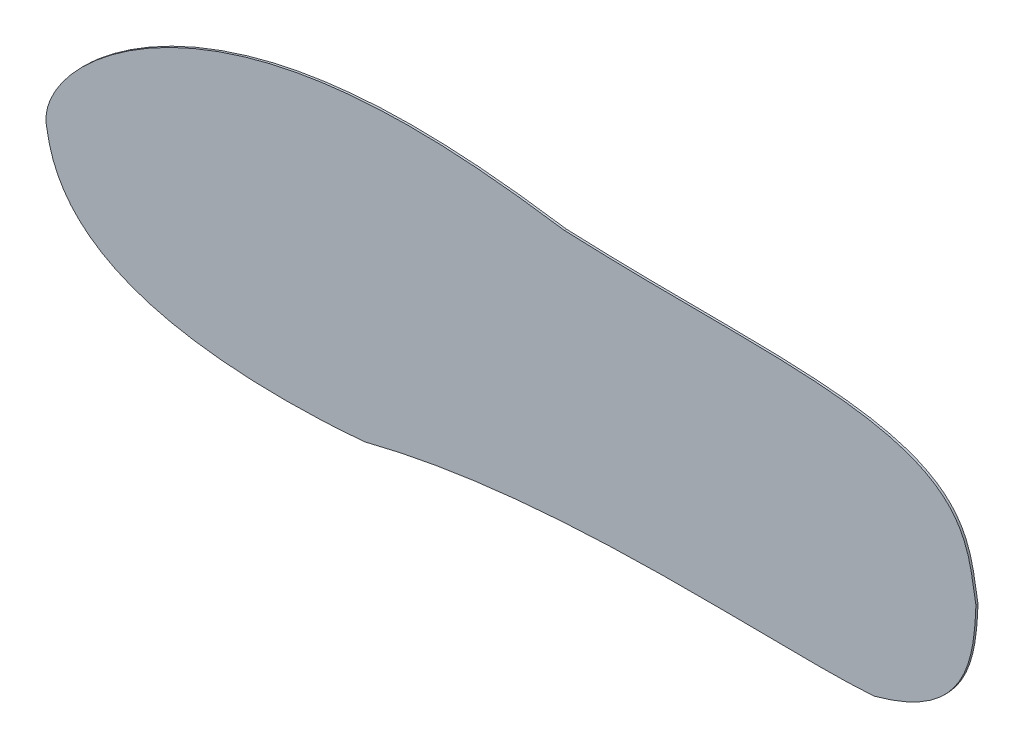
ISO-10303-21;
HEADER;
FILE_DESCRIPTION(('STEP AP214'),'2;1');
FILE_NAME('part.step','',(''),(''),'','','');
FILE_SCHEMA(('AUTOMOTIVE_DESIGN { 1 0 10303 214 1 1 1 1 }'));
ENDSEC;
DATA;
#1=APPLICATION_CONTEXT('core data for automotive mechanical design processes');
#2=APPLICATION_PROTOCOL_DEFINITION('international standard','automotive_design',2000,#1);
#3=PRODUCT_CONTEXT('',#1,'mechanical');
#4=PRODUCT('Part','Part','',(#3));
#5=PRODUCT_RELATED_PRODUCT_CATEGORY('part','',(#4));
#6=PRODUCT_DEFINITION_FORMATION('','',#4);
#7=PRODUCT_DEFINITION_CONTEXT('part definition',#1,'design');
#8=PRODUCT_DEFINITION('design','',#6,#7);
#9=PRODUCT_DEFINITION_SHAPE('','',#8);
#10=(LENGTH_UNIT() NAMED_UNIT(*) SI_UNIT(.MILLI.,.METRE.));
#11=(NAMED_UNIT(*) PLANE_ANGLE_UNIT() SI_UNIT($,.RADIAN.));
#12=(NAMED_UNIT(*) SI_UNIT($,.STERADIAN.) SOLID_ANGLE_UNIT());
#13=UNCERTAINTY_MEASURE_WITH_UNIT(LENGTH_MEASURE(1.E-05),#10,'distance_accuracy_value','');
#14=(GEOMETRIC_REPRESENTATION_CONTEXT(3) GLOBAL_UNCERTAINTY_ASSIGNED_CONTEXT((#13)) GLOBAL_UNIT_ASSIGNED_CONTEXT((#10,
#11,#12)) REPRESENTATION_CONTEXT('',''));
#15=CARTESIAN_POINT('',(0.,0.,0.));
#16=DIRECTION('',(0.,0.,1.));
#17=DIRECTION('',(1.,0.,0.));
#18=AXIS2_PLACEMENT_3D('',#15,#16,#17);
#19=CARTESIAN_POINT('',(350.944712184731,26.5417961869799,3.));
#20=CARTESIAN_POINT('',(335.123625207238,112.239350648397,3.));
#21=CARTESIAN_POINT('',(344.352592610776,212.439568172516,3.));
#22=CARTESIAN_POINT('',(110.991559692762,191.34478553586,3.));
#23=CARTESIAN_POINT('',(-39.3087665934162,187.389513791486,3.));
#24=CARTESIAN_POINT('',(-234.43550598249,195.300057280233,3.));
#25=B_SPLINE_CURVE_WITH_KNOTS('',5,(#19,#20,#21,#22,#23,#24),.UNSPECIFIED.,.F.,.F.,(6,6),(0.,
1.),.UNSPECIFIED.);
#26=DIRECTION('',(0.,0.,-1.));
#27=VECTOR('',#26,1.);
#28=SURFACE_OF_LINEAR_EXTRUSION('',#25,#27);
#29=CARTESIAN_POINT('',(350.944712184731,26.5417961869799,0.));
#30=CARTESIAN_POINT('',(335.123625207238,112.239350648397,0.));
#31=CARTESIAN_POINT('',(344.352592610776,212.439568172516,0.));
#32=CARTESIAN_POINT('',(110.991559692762,191.34478553586,0.));
#33=CARTESIAN_POINT('',(-39.3087665934162,187.389513791486,0.));
#34=CARTESIAN_POINT('',(-234.43550598249,195.300057280233,0.));
#35=B_SPLINE_CURVE_WITH_KNOTS('',5,(#29,#30,#31,#32,#33,#34),.UNSPECIFIED.,.F.,.F.,(6,6),(0.,
1.),.UNSPECIFIED.);
#36=CARTESIAN_POINT('',(350.944712184731,26.5417961869799,0.));
#37=VERTEX_POINT('',#36);
#38=CARTESIAN_POINT('',(-234.43550598249,195.300057280233,0.));
#39=VERTEX_POINT('',#38);
#40=EDGE_CURVE('E180',#37,#39,#35,.T.);
#41=ORIENTED_EDGE('',*,*,#40,.T.);
#42=DIRECTION('',(0.,0.,-1.));
#43=VECTOR('',#42,1.);
#44=CARTESIAN_POINT('',(-234.43550598249,195.300057280233,3.));
#45=LINE('',#44,#43);
#46=CARTESIAN_POINT('',(-234.43550598249,195.300057280233,3.));
#47=VERTEX_POINT('',#46);
#48=EDGE_CURVE('E11',#47,#39,#45,.T.);
#49=ORIENTED_EDGE('',*,*,#48,.F.);
#50=CARTESIAN_POINT('',(350.944712184731,26.5417961869799,3.));
#51=VERTEX_POINT('',#50);
#52=EDGE_CURVE('E144',#51,#47,#25,.T.);
#53=ORIENTED_EDGE('',*,*,#52,.F.);
#54=DIRECTION('',(0.,0.,-1.));
#55=VECTOR('',#54,1.);
#56=CARTESIAN_POINT('',(350.944712184731,26.5417961869799,3.));
#57=LINE('',#56,#55);
#58=EDGE_CURVE('E115',#51,#37,#57,.T.);
#59=ORIENTED_EDGE('',*,*,#58,.T.);
#60=EDGE_LOOP('',(#41,#49,#53,#59));
#61=FACE_BOUND('',#60,.T.);
#62=ADVANCED_FACE('F39',(#61),#28,.F.);
#63=CARTESIAN_POINT('',(-234.43550598249,195.300057280233,3.));
#64=CARTESIAN_POINT('',(-517.896647662563,237.489622553546,3.));
#65=CARTESIAN_POINT('',(-763.123495813696,229.5790790648,3.));
#66=CARTESIAN_POINT('',(-984.61871349859,42.3628831644723,3.));
#67=CARTESIAN_POINT('',(-971.43447435068,-43.3346712969451,3.));
#68=B_SPLINE_CURVE_WITH_KNOTS('',4,(#63,#64,#65,#66,#67),.UNSPECIFIED.,.F.,.F.,(5,5),(0.,1.),.UNSPECIFIED.);
#69=DIRECTION('',(0.,0.,-1.));
#70=VECTOR('',#69,1.);
#71=SURFACE_OF_LINEAR_EXTRUSION('',#68,#70);
#72=CARTESIAN_POINT('',(-234.43550598249,195.300057280233,0.));
#73=CARTESIAN_POINT('',(-517.896647662563,237.489622553546,0.));
#74=CARTESIAN_POINT('',(-763.123495813696,229.5790790648,0.));
#75=CARTESIAN_POINT('',(-984.61871349859,42.3628831644723,0.));
#76=CARTESIAN_POINT('',(-971.43447435068,-43.3346712969451,0.));
#77=B_SPLINE_CURVE_WITH_KNOTS('',4,(#72,#73,#74,#75,#76),.UNSPECIFIED.,.F.,.F.,(5,5),(0.,1.),.UNSPECIFIED.);
#78=CARTESIAN_POINT('',(-971.43447435068,-43.3346712969451,0.));
#79=VERTEX_POINT('',#78);
#80=EDGE_CURVE('E177',#39,#79,#77,.T.);
#81=ORIENTED_EDGE('',*,*,#80,.T.);
#82=DIRECTION('',(0.,0.,-1.));
#83=VECTOR('',#82,1.);
#84=CARTESIAN_POINT('',(-971.43447435068,-43.3346712969451,3.));
#85=LINE('',#84,#83);
#86=CARTESIAN_POINT('',(-971.43447435068,-43.3346712969451,3.));
#87=VERTEX_POINT('',#86);
#88=EDGE_CURVE('E49',#87,#79,#85,.T.);
#89=ORIENTED_EDGE('',*,*,#88,.F.);
#90=EDGE_CURVE('E91',#47,#87,#68,.T.);
#91=ORIENTED_EDGE('',*,*,#90,.F.);
#92=ORIENTED_EDGE('',*,*,#48,.T.);
#93=EDGE_LOOP('',(#81,#89,#91,#92));
#94=FACE_BOUND('',#93,.T.);
#95=ADVANCED_FACE('F138',(#94),#71,.F.);
#96=CARTESIAN_POINT('',(-971.43447435068,-43.3346712969451,3.));
#97=CARTESIAN_POINT('',(-965.889041594795,-79.3799842101972,3.));
#98=CARTESIAN_POINT('',(-955.015213130703,-113.575896827192,3.));
#99=CARTESIAN_POINT('',(-933.247198640049,-144.680841704565,3.));
#100=CARTESIAN_POINT('',(-900.325733018769,-171.127706787118,3.));
#101=CARTESIAN_POINT('',(-856.474401455027,-191.531042627468,3.));
#102=CARTESIAN_POINT('',(-802.47958261225,-205.311521099048,3.));
#103=CARTESIAN_POINT('',(-739.779407352663,-212.900711219807,3.));
#104=CARTESIAN_POINT('',(-670.195395857913,-215.500190489557,3.));
#105=CARTESIAN_POINT('',(-595.630323172639,-214.629393006669,3.));
#106=CARTESIAN_POINT('',(-517.896647662563,-207.111377280163,3.));
#107=B_SPLINE_CURVE_WITH_KNOTS('',10,(#96,#97,#98,#99,#100,#101,#102,#103,#104,#105,#106),
.UNSPECIFIED.,.F.,.F.,(11,11),(0.,1.),.UNSPECIFIED.);
#108=DIRECTION('',(0.,0.,-1.));
#109=VECTOR('',#108,1.);
#110=SURFACE_OF_LINEAR_EXTRUSION('',#107,#109);
#111=CARTESIAN_POINT('',(-971.43447435068,-43.3346712969451,0.));
#112=CARTESIAN_POINT('',(-965.889041594795,-79.3799842101972,0.));
#113=CARTESIAN_POINT('',(-955.015213130703,-113.575896827192,0.));
#114=CARTESIAN_POINT('',(-933.247198640049,-144.680841704565,0.));
#115=CARTESIAN_POINT('',(-900.325733018769,-171.127706787118,0.));
#116=CARTESIAN_POINT('',(-856.474401455027,-191.531042627468,0.));
#117=CARTESIAN_POINT('',(-802.47958261225,-205.311521099048,0.));
#118=CARTESIAN_POINT('',(-739.779407352663,-212.900711219807,0.));
#119=CARTESIAN_POINT('',(-670.195395857913,-215.500190489557,0.));
#120=CARTESIAN_POINT('',(-595.630323172639,-214.629393006669,0.));
#121=CARTESIAN_POINT('',(-517.896647662563,-207.111377280163,0.));
#122=B_SPLINE_CURVE_WITH_KNOTS('',10,(#111,#112,#113,#114,#115,#116,#117,#118,#119,#120,#121),
.UNSPECIFIED.,.F.,.F.,(11,11),(0.,1.),.UNSPECIFIED.);
#123=CARTESIAN_POINT('',(-517.896647662563,-207.111377280163,0.));
#124=VERTEX_POINT('',#123);
#125=EDGE_CURVE('E107',#79,#124,#122,.T.);
#126=ORIENTED_EDGE('',*,*,#125,.T.);
#127=DIRECTION('',(0.,0.,-1.));
#128=VECTOR('',#127,1.);
#129=CARTESIAN_POINT('',(-517.896647662563,-207.111377280163,3.));
#130=LINE('',#129,#128);
#131=CARTESIAN_POINT('',(-517.896647662563,-207.111377280163,3.));
#132=VERTEX_POINT('',#131);
#133=EDGE_CURVE('E104',#132,#124,#130,.T.);
#134=ORIENTED_EDGE('',*,*,#133,.F.);
#135=EDGE_CURVE('E95',#87,#132,#107,.T.);
#136=ORIENTED_EDGE('',*,*,#135,.F.);
#137=ORIENTED_EDGE('',*,*,#88,.T.);
#138=EDGE_LOOP('',(#126,#134,#136,#137));
#139=FACE_BOUND('',#138,.T.);
#140=ADVANCED_FACE('F105',(#139),#110,.F.);
#141=CARTESIAN_POINT('',(-517.896647662563,-207.111377280163,3.));
#142=CARTESIAN_POINT('',(-238.390777726863,-135.624345332318,3.));
#143=CARTESIAN_POINT('',(58.7368880355573,-169.111985960051,3.));
#144=CARTESIAN_POINT('',(205.975315303988,-158.252063681852,3.));
#145=B_SPLINE_CURVE_WITH_KNOTS('',3,(#141,#142,#143,#144),.UNSPECIFIED.,.F.,.F.,(4,4),(0.,1.),.UNSPECIFIED.);
#146=DIRECTION('',(0.,0.,-1.));
#147=VECTOR('',#146,1.);
#148=SURFACE_OF_LINEAR_EXTRUSION('',#145,#147);
#149=CARTESIAN_POINT('',(-517.896647662563,-207.111377280163,0.));
#150=CARTESIAN_POINT('',(-238.390777726863,-135.624345332318,0.));
#151=CARTESIAN_POINT('',(58.7368880355573,-169.111985960051,0.));
#152=CARTESIAN_POINT('',(205.975315303988,-158.252063681852,0.));
#153=B_SPLINE_CURVE_WITH_KNOTS('',3,(#149,#150,#151,#152),.UNSPECIFIED.,.F.,.F.,(4,4),(0.,1.),.UNSPECIFIED.);
#154=CARTESIAN_POINT('',(205.975315303988,-158.252063681852,0.));
#155=VERTEX_POINT('',#154);
#156=EDGE_CURVE('E77',#124,#155,#153,.T.);
#157=ORIENTED_EDGE('',*,*,#156,.T.);
#158=DIRECTION('',(0.,0.,-1.));
#159=VECTOR('',#158,1.);
#160=CARTESIAN_POINT('',(205.975315303988,-158.252063681852,3.));
#161=LINE('',#160,#159);
#162=CARTESIAN_POINT('',(205.975315303988,-158.252063681852,3.));
#163=VERTEX_POINT('',#162);
#164=EDGE_CURVE('E109',#163,#155,#161,.T.);
#165=ORIENTED_EDGE('',*,*,#164,.F.);
#166=EDGE_CURVE('E99',#132,#163,#145,.T.);
#167=ORIENTED_EDGE('',*,*,#166,.F.);
#168=ORIENTED_EDGE('',*,*,#133,.T.);
#169=EDGE_LOOP('',(#157,#165,#167,#168));
#170=FACE_BOUND('',#169,.T.);
#171=ADVANCED_FACE('F111',(#170),#148,.F.);
#172=CARTESIAN_POINT('',(205.975315303988,-158.252063681852,3.));
#173=CARTESIAN_POINT('',(237.720115622273,-149.710854675872,3.));
#174=CARTESIAN_POINT('',(265.982749076295,-139.109635687713,3.));
#175=CARTESIAN_POINT('',(290.378266605,-126.12240595678,3.));
#176=CARTESIAN_POINT('',(310.567810518418,-110.520206629003,3.));
#177=CARTESIAN_POINT('',(326.320687278186,-92.2337144643127,3.));
#178=CARTESIAN_POINT('',(337.608771477276,-71.4114547751335,3.));
#179=CARTESIAN_POINT('',(344.730220583579,-48.4548671267451,3.));
#180=CARTESIAN_POINT('',(348.436488577808,-24.0002171054734,3.));
#181=CARTESIAN_POINT('',(349.985945306598,1.19747360529278,3.));
#182=CARTESIAN_POINT('',(350.944712184731,26.5417961869799,3.));
#183=B_SPLINE_CURVE_WITH_KNOTS('',10,(#172,#173,#174,#175,#176,#177,#178,#179,#180,#181,#182),
.UNSPECIFIED.,.F.,.F.,(11,11),(0.,1.),.UNSPECIFIED.);
#184=DIRECTION('',(0.,0.,-1.));
#185=VECTOR('',#184,1.);
#186=SURFACE_OF_LINEAR_EXTRUSION('',#183,#185);
#187=CARTESIAN_POINT('',(205.975315303988,-158.252063681852,0.));
#188=CARTESIAN_POINT('',(237.720115622273,-149.710854675872,0.));
#189=CARTESIAN_POINT('',(265.982749076295,-139.109635687713,0.));
#190=CARTESIAN_POINT('',(290.378266605,-126.12240595678,0.));
#191=CARTESIAN_POINT('',(310.567810518418,-110.520206629003,0.));
#192=CARTESIAN_POINT('',(326.320687278186,-92.2337144643127,0.));
#193=CARTESIAN_POINT('',(337.608771477276,-71.4114547751335,0.));
#194=CARTESIAN_POINT('',(344.730220583579,-48.4548671267451,0.));
#195=CARTESIAN_POINT('',(348.436488577808,-24.0002171054734,0.));
#196=CARTESIAN_POINT('',(349.985945306598,1.19747360529278,0.));
#197=CARTESIAN_POINT('',(350.944712184731,26.5417961869799,0.));
#198=B_SPLINE_CURVE_WITH_KNOTS('',10,(#187,#188,#189,#190,#191,#192,#193,#194,#195,#196,#197),
.UNSPECIFIED.,.F.,.F.,(11,11),(0.,1.),.UNSPECIFIED.);
#199=EDGE_CURVE('E83',#155,#37,#198,.T.);
#200=ORIENTED_EDGE('',*,*,#199,.T.);
#201=ORIENTED_EDGE('',*,*,#58,.F.);
#202=EDGE_CURVE('E57',#163,#51,#183,.T.);
#203=ORIENTED_EDGE('',*,*,#202,.F.);
#204=ORIENTED_EDGE('',*,*,#164,.T.);
#205=EDGE_LOOP('',(#200,#201,#203,#204));
#206=FACE_BOUND('',#205,.T.);
#207=ADVANCED_FACE('F135',(#206),#186,.F.);
#208=CARTESIAN_POINT('',(192.157031947085,179.93217852345,3.));
#209=DIRECTION('',(0.,0.,-1.));
#210=DIRECTION('',(-1.,0.,0.));
#211=AXIS2_PLACEMENT_3D('',#208,#209,#210);
#212=PLANE('',#211);
#213=ORIENTED_EDGE('',*,*,#52,.T.);
#214=ORIENTED_EDGE('',*,*,#90,.T.);
#215=ORIENTED_EDGE('',*,*,#135,.T.);
#216=ORIENTED_EDGE('',*,*,#166,.T.);
#217=ORIENTED_EDGE('',*,*,#202,.T.);
#218=EDGE_LOOP('',(#213,#214,#215,#216,#217));
#219=FACE_BOUND('',#218,.T.);
#220=ADVANCED_FACE('F97',(#219),#212,.F.);
#221=CARTESIAN_POINT('',(192.157031947085,179.93217852345,0.));
#222=DIRECTION('',(0.,0.,-1.));
#223=DIRECTION('',(-1.,0.,0.));
#224=AXIS2_PLACEMENT_3D('',#221,#222,#223);
#225=PLANE('',#224);
#226=ORIENTED_EDGE('',*,*,#40,.F.);
#227=ORIENTED_EDGE('',*,*,#199,.F.);
#228=ORIENTED_EDGE('',*,*,#156,.F.);
#229=ORIENTED_EDGE('',*,*,#125,.F.);
#230=ORIENTED_EDGE('',*,*,#80,.F.);
#231=EDGE_LOOP('',(#226,#227,#228,#229,#230));
#232=FACE_BOUND('',#231,.T.);
#233=ADVANCED_FACE('F176',(#232),#225,.T.);
#234=CLOSED_SHELL('',(#62,#95,#140,#171,#207,#220,#233));
#235=MANIFOLD_SOLID_BREP('B2',#234);
#236=ADVANCED_BREP_SHAPE_REPRESENTATION('',(#18,#235),#14);
#237=SHAPE_DEFINITION_REPRESENTATION(#9,#236);
ENDSEC;
END-ISO-10303-21;
